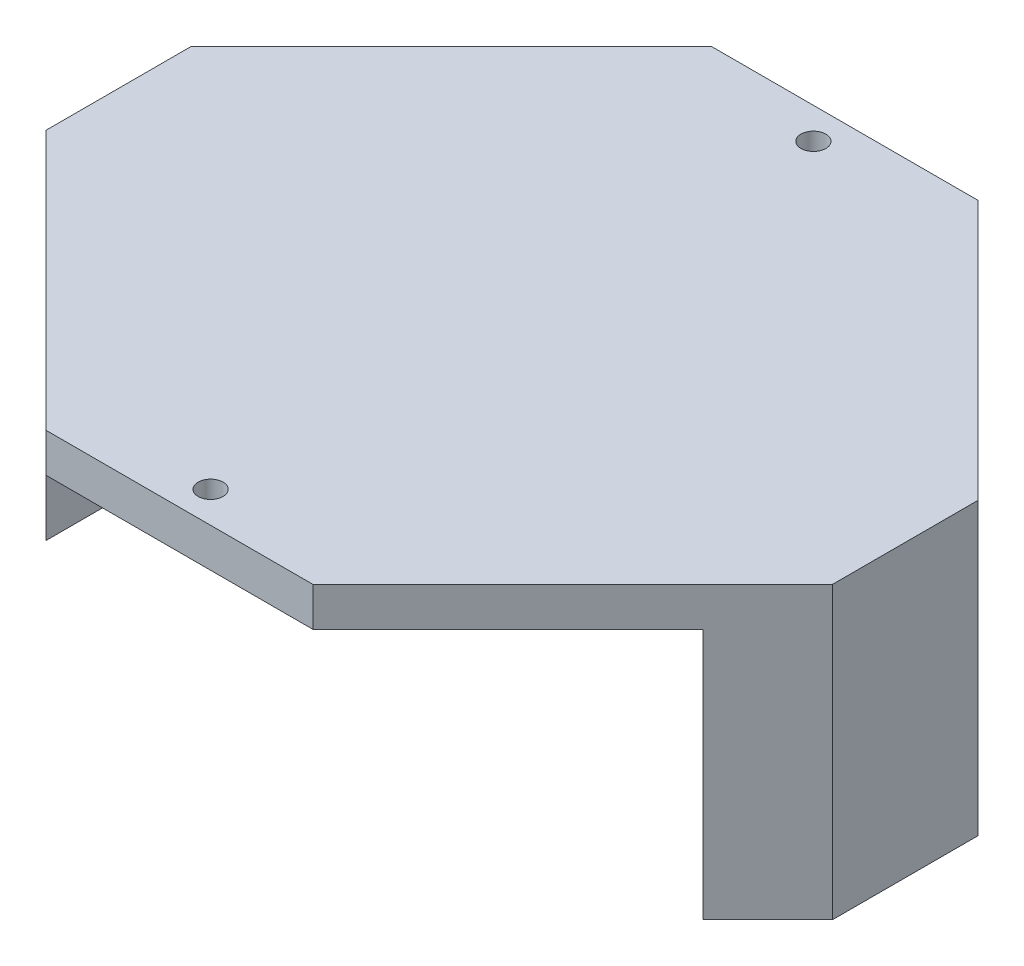
ISO-10303-21;
HEADER;
FILE_DESCRIPTION(('STEP AP214'),'2;1');
FILE_NAME('part.step','',(''),(''),'','','');
FILE_SCHEMA(('AUTOMOTIVE_DESIGN { 1 0 10303 214 1 1 1 1 }'));
ENDSEC;
DATA;
#1=APPLICATION_CONTEXT('core data for automotive mechanical design processes');
#2=APPLICATION_PROTOCOL_DEFINITION('international standard','automotive_design',2000,#1);
#3=PRODUCT_CONTEXT('',#1,'mechanical');
#4=PRODUCT('Part','Part','',(#3));
#5=PRODUCT_RELATED_PRODUCT_CATEGORY('part','',(#4));
#6=PRODUCT_DEFINITION_FORMATION('','',#4);
#7=PRODUCT_DEFINITION_CONTEXT('part definition',#1,'design');
#8=PRODUCT_DEFINITION('design','',#6,#7);
#9=PRODUCT_DEFINITION_SHAPE('','',#8);
#10=(LENGTH_UNIT() NAMED_UNIT(*) SI_UNIT(.MILLI.,.METRE.));
#11=(NAMED_UNIT(*) PLANE_ANGLE_UNIT() SI_UNIT($,.RADIAN.));
#12=(NAMED_UNIT(*) SI_UNIT($,.STERADIAN.) SOLID_ANGLE_UNIT());
#13=UNCERTAINTY_MEASURE_WITH_UNIT(LENGTH_MEASURE(1.E-05),#10,'distance_accuracy_value','');
#14=(GEOMETRIC_REPRESENTATION_CONTEXT(3) GLOBAL_UNCERTAINTY_ASSIGNED_CONTEXT((#13)) GLOBAL_UNIT_ASSIGNED_CONTEXT((#10,
#11,#12)) REPRESENTATION_CONTEXT('',''));
#15=CARTESIAN_POINT('',(0.,0.,0.));
#16=DIRECTION('',(0.,0.,1.));
#17=DIRECTION('',(1.,0.,0.));
#18=AXIS2_PLACEMENT_3D('',#15,#16,#17);
#19=CARTESIAN_POINT('',(0.,12.98575,40.64));
#20=DIRECTION('',(0.,1.,0.));
#21=DIRECTION('',(-1.,0.,0.));
#22=AXIS2_PLACEMENT_3D('',#19,#20,#21);
#23=PLANE('',#22);
#24=CARTESIAN_POINT('',(0.,12.98575,36.83));
#25=DIRECTION('',(0.,1.,0.));
#26=DIRECTION('',(-1.,0.,0.));
#27=AXIS2_PLACEMENT_3D('',#24,#25,#26);
#28=CIRCLE('',#27,1.524);
#29=CARTESIAN_POINT('',(-1.524,12.98575,36.83));
#30=VERTEX_POINT('',#29);
#31=EDGE_CURVE('E186',#30,#30,#28,.T.);
#32=ORIENTED_EDGE('',*,*,#31,.T.);
#33=EDGE_LOOP('',(#32));
#34=FACE_BOUND('',#33,.T.);
#35=CARTESIAN_POINT('',(0.,12.98575,-36.83));
#36=DIRECTION('',(0.,1.,0.));
#37=DIRECTION('',(-1.,0.,0.));
#38=AXIS2_PLACEMENT_3D('',#35,#36,#37);
#39=CIRCLE('',#38,1.524);
#40=CARTESIAN_POINT('',(-1.524,12.98575,-36.83));
#41=VERTEX_POINT('',#40);
#42=EDGE_CURVE('E145',#41,#41,#39,.T.);
#43=ORIENTED_EDGE('',*,*,#42,.T.);
#44=EDGE_LOOP('',(#43));
#45=FACE_BOUND('',#44,.T.);
#46=DIRECTION('',(1.,0.,0.));
#47=VECTOR('',#46,1.);
#48=CARTESIAN_POINT('',(0.,12.98575,40.64));
#49=LINE('',#48,#47);
#50=CARTESIAN_POINT('',(-16.3067999999995,12.98575,40.64));
#51=VERTEX_POINT('',#50);
#52=CARTESIAN_POINT('',(16.3067999999998,12.98575,40.64));
#53=VERTEX_POINT('',#52);
#54=EDGE_CURVE('E152',#51,#53,#49,.T.);
#55=ORIENTED_EDGE('',*,*,#54,.F.);
#56=DIRECTION('',(-0.707106781186551,0.,-0.707106781186544));
#57=VECTOR('',#56,1.);
#58=CARTESIAN_POINT('',(-16.3067999999995,12.98575,40.64));
#59=LINE('',#58,#57);
#60=CARTESIAN_POINT('',(-40.132,12.98575,16.8147999999997));
#61=VERTEX_POINT('',#60);
#62=EDGE_CURVE('E201',#51,#61,#59,.T.);
#63=ORIENTED_EDGE('',*,*,#62,.T.);
#64=DIRECTION('',(0.,0.,-1.));
#65=VECTOR('',#64,1.);
#66=CARTESIAN_POINT('',(-40.132,12.98575,40.64));
#67=LINE('',#66,#65);
#68=CARTESIAN_POINT('',(-40.132,12.98575,-16.8147999999996));
#69=VERTEX_POINT('',#68);
#70=EDGE_CURVE('E159',#61,#69,#67,.T.);
#71=ORIENTED_EDGE('',*,*,#70,.T.);
#72=DIRECTION('',(-0.707106781186544,0.,0.707106781186551));
#73=VECTOR('',#72,1.);
#74=CARTESIAN_POINT('',(-48.0568,12.98575,-8.88999999999945));
#75=LINE('',#74,#73);
#76=CARTESIAN_POINT('',(-16.3067999999998,12.98575,-40.64));
#77=VERTEX_POINT('',#76);
#78=EDGE_CURVE('E199',#69,#77,#75,.F.);
#79=ORIENTED_EDGE('',*,*,#78,.T.);
#80=DIRECTION('',(1.,0.,0.));
#81=VECTOR('',#80,1.);
#82=CARTESIAN_POINT('',(0.,12.98575,-40.64));
#83=LINE('',#82,#81);
#84=CARTESIAN_POINT('',(16.3067999999994,12.98575,-40.64));
#85=VERTEX_POINT('',#84);
#86=EDGE_CURVE('E151',#77,#85,#83,.T.);
#87=ORIENTED_EDGE('',*,*,#86,.T.);
#88=DIRECTION('',(0.707106781186551,0.,0.707106781186544));
#89=VECTOR('',#88,1.);
#90=CARTESIAN_POINT('',(16.3067999999994,12.98575,-40.64));
#91=LINE('',#90,#89);
#92=CARTESIAN_POINT('',(40.132,12.98575,-16.8147999999997));
#93=VERTEX_POINT('',#92);
#94=EDGE_CURVE('E197',#85,#93,#91,.T.);
#95=ORIENTED_EDGE('',*,*,#94,.T.);
#96=DIRECTION('',(0.,0.,-1.));
#97=VECTOR('',#96,1.);
#98=CARTESIAN_POINT('',(40.132,12.98575,40.64));
#99=LINE('',#98,#97);
#100=CARTESIAN_POINT('',(40.132,12.98575,16.8147999999995));
#101=VERTEX_POINT('',#100);
#102=EDGE_CURVE('E182',#101,#93,#99,.T.);
#103=ORIENTED_EDGE('',*,*,#102,.F.);
#104=DIRECTION('',(0.707106781186544,0.,-0.707106781186551));
#105=VECTOR('',#104,1.);
#106=CARTESIAN_POINT('',(48.0568,12.98575,8.88999999999945));
#107=LINE('',#106,#105);
#108=EDGE_CURVE('E195',#101,#53,#107,.F.);
#109=ORIENTED_EDGE('',*,*,#108,.T.);
#110=EDGE_LOOP('',(#55,#63,#71,#79,#87,#95,#103,#109));
#111=FACE_BOUND('',#110,.T.);
#112=ADVANCED_FACE('F33',(#34,#45,#111),#23,.F.);
#113=CARTESIAN_POINT('',(40.132,0.,40.64));
#114=DIRECTION('',(1.,0.,0.));
#115=DIRECTION('',(0.,0.,-1.));
#116=AXIS2_PLACEMENT_3D('',#113,#114,#115);
#117=PLANE('',#116);
#118=ORIENTED_EDGE('',*,*,#102,.T.);
#119=DIRECTION('',(0.,-1.,0.));
#120=VECTOR('',#119,1.);
#121=CARTESIAN_POINT('',(40.132,0.,-16.8147999999997));
#122=LINE('',#121,#120);
#123=CARTESIAN_POINT('',(40.132,-17.74825,-16.8147999999997));
#124=VERTEX_POINT('',#123);
#125=EDGE_CURVE('E231',#93,#124,#122,.T.);
#126=ORIENTED_EDGE('',*,*,#125,.T.);
#127=DIRECTION('',(0.,0.,-1.));
#128=VECTOR('',#127,1.);
#129=CARTESIAN_POINT('',(40.132,-17.74825,40.64));
#130=LINE('',#129,#128);
#131=CARTESIAN_POINT('',(40.132,-17.74825,16.8147999999995));
#132=VERTEX_POINT('',#131);
#133=EDGE_CURVE('E180',#132,#124,#130,.T.);
#134=ORIENTED_EDGE('',*,*,#133,.F.);
#135=DIRECTION('',(0.,-1.,0.));
#136=VECTOR('',#135,1.);
#137=CARTESIAN_POINT('',(40.132,0.,16.8147999999995));
#138=LINE('',#137,#136);
#139=EDGE_CURVE('E229',#132,#101,#138,.F.);
#140=ORIENTED_EDGE('',*,*,#139,.T.);
#141=EDGE_LOOP('',(#118,#126,#134,#140));
#142=FACE_BOUND('',#141,.T.);
#143=ADVANCED_FACE('F242',(#142),#117,.F.);
#144=CARTESIAN_POINT('',(0.,-17.74825,40.64));
#145=DIRECTION('',(0.,1.,0.));
#146=DIRECTION('',(0.,0.,1.));
#147=AXIS2_PLACEMENT_3D('',#144,#145,#146);
#148=PLANE('',#147);
#149=CARTESIAN_POINT('',(44.0944,-17.74825,0.));
#150=DIRECTION('',(0.,-1.,0.));
#151=DIRECTION('',(0.,0.,-1.));
#152=AXIS2_PLACEMENT_3D('',#149,#150,#151);
#153=CIRCLE('',#152,1.524);
#154=CARTESIAN_POINT('',(44.0944,-17.74825,-1.524));
#155=VERTEX_POINT('',#154);
#156=EDGE_CURVE('E138',#155,#155,#153,.T.);
#157=ORIENTED_EDGE('',*,*,#156,.F.);
#158=EDGE_LOOP('',(#157));
#159=FACE_BOUND('',#158,.T.);
#160=ORIENTED_EDGE('',*,*,#133,.T.);
#161=DIRECTION('',(0.707106781186551,0.,0.707106781186544));
#162=VECTOR('',#161,1.);
#163=CARTESIAN_POINT('',(16.3067999999994,-17.74825,-40.64));
#164=LINE('',#163,#162);
#165=CARTESIAN_POINT('',(48.0568,-17.74825,-8.88999999999978));
#166=VERTEX_POINT('',#165);
#167=EDGE_CURVE('E48',#124,#166,#164,.T.);
#168=ORIENTED_EDGE('',*,*,#167,.T.);
#169=DIRECTION('',(0.,0.,-1.));
#170=VECTOR('',#169,1.);
#171=CARTESIAN_POINT('',(48.0568,-17.74825,40.64));
#172=LINE('',#171,#170);
#173=CARTESIAN_POINT('',(48.0568,-17.74825,8.88999999999945));
#174=VERTEX_POINT('',#173);
#175=EDGE_CURVE('E178',#174,#166,#172,.T.);
#176=ORIENTED_EDGE('',*,*,#175,.F.);
#177=DIRECTION('',(0.707106781186544,0.,-0.707106781186551));
#178=VECTOR('',#177,1.);
#179=CARTESIAN_POINT('',(48.0568,-17.74825,8.88999999999945));
#180=LINE('',#179,#178);
#181=EDGE_CURVE('E56',#174,#132,#180,.F.);
#182=ORIENTED_EDGE('',*,*,#181,.T.);
#183=EDGE_LOOP('',(#160,#168,#176,#182));
#184=FACE_BOUND('',#183,.T.);
#185=ADVANCED_FACE('F239',(#159,#184),#148,.F.);
#186=CARTESIAN_POINT('',(48.0568,0.,40.64));
#187=DIRECTION('',(1.,0.,0.));
#188=DIRECTION('',(0.,0.,-1.));
#189=AXIS2_PLACEMENT_3D('',#186,#187,#188);
#190=PLANE('',#189);
#191=ORIENTED_EDGE('',*,*,#175,.T.);
#192=DIRECTION('',(0.,1.,0.));
#193=VECTOR('',#192,1.);
#194=CARTESIAN_POINT('',(48.0568,17.74825,-8.88999999999978));
#195=LINE('',#194,#193);
#196=CARTESIAN_POINT('',(48.0568,17.74825,-8.88999999999978));
#197=VERTEX_POINT('',#196);
#198=EDGE_CURVE('E11',#166,#197,#195,.T.);
#199=ORIENTED_EDGE('',*,*,#198,.T.);
#200=DIRECTION('',(0.,0.,-1.));
#201=VECTOR('',#200,1.);
#202=CARTESIAN_POINT('',(48.0568,17.74825,40.64));
#203=LINE('',#202,#201);
#204=CARTESIAN_POINT('',(48.0568,17.74825,8.88999999999945));
#205=VERTEX_POINT('',#204);
#206=EDGE_CURVE('E175',#205,#197,#203,.T.);
#207=ORIENTED_EDGE('',*,*,#206,.F.);
#208=DIRECTION('',(0.,-1.,0.));
#209=VECTOR('',#208,1.);
#210=CARTESIAN_POINT('',(48.0568,0.,8.88999999999945));
#211=LINE('',#210,#209);
#212=EDGE_CURVE('E41',#205,#174,#211,.T.);
#213=ORIENTED_EDGE('',*,*,#212,.T.);
#214=EDGE_LOOP('',(#191,#199,#207,#213));
#215=FACE_BOUND('',#214,.T.);
#216=ADVANCED_FACE('F236',(#215),#190,.T.);
#217=CARTESIAN_POINT('',(0.,17.74825,40.64));
#218=DIRECTION('',(0.,1.,0.));
#219=DIRECTION('',(0.,0.,1.));
#220=AXIS2_PLACEMENT_3D('',#217,#218,#219);
#221=PLANE('',#220);
#222=CARTESIAN_POINT('',(0.,17.74825,36.83));
#223=DIRECTION('',(0.,1.,0.));
#224=DIRECTION('',(0.,0.,1.));
#225=AXIS2_PLACEMENT_3D('',#222,#223,#224);
#226=CIRCLE('',#225,1.524);
#227=CARTESIAN_POINT('',(0.,17.74825,38.354));
#228=VERTEX_POINT('',#227);
#229=EDGE_CURVE('E190',#228,#228,#226,.T.);
#230=ORIENTED_EDGE('',*,*,#229,.F.);
#231=EDGE_LOOP('',(#230));
#232=FACE_BOUND('',#231,.T.);
#233=CARTESIAN_POINT('',(0.,17.74825,-36.83));
#234=DIRECTION('',(0.,1.,0.));
#235=DIRECTION('',(0.,0.,1.));
#236=AXIS2_PLACEMENT_3D('',#233,#234,#235);
#237=CIRCLE('',#236,1.524);
#238=CARTESIAN_POINT('',(0.,17.74825,-35.306));
#239=VERTEX_POINT('',#238);
#240=EDGE_CURVE('E189',#239,#239,#237,.T.);
#241=ORIENTED_EDGE('',*,*,#240,.F.);
#242=EDGE_LOOP('',(#241));
#243=FACE_BOUND('',#242,.T.);
#244=DIRECTION('',(0.,0.,-1.));
#245=VECTOR('',#244,1.);
#246=CARTESIAN_POINT('',(-48.0568,17.74825,40.64));
#247=LINE('',#246,#245);
#248=CARTESIAN_POINT('',(-48.0568,17.74825,8.88999999999978));
#249=VERTEX_POINT('',#248);
#250=CARTESIAN_POINT('',(-48.0568,17.74825,-8.88999999999945));
#251=VERTEX_POINT('',#250);
#252=EDGE_CURVE('E172',#249,#251,#247,.T.);
#253=ORIENTED_EDGE('',*,*,#252,.F.);
#254=DIRECTION('',(0.707106781186551,0.,0.707106781186544));
#255=VECTOR('',#254,1.);
#256=CARTESIAN_POINT('',(-8.15339999999965,17.74825,48.7933999999997));
#257=LINE('',#256,#255);
#258=CARTESIAN_POINT('',(-16.3067999999995,17.74825,40.64));
#259=VERTEX_POINT('',#258);
#260=EDGE_CURVE('E222',#249,#259,#257,.T.);
#261=ORIENTED_EDGE('',*,*,#260,.T.);
#262=DIRECTION('',(1.,0.,0.));
#263=VECTOR('',#262,1.);
#264=CARTESIAN_POINT('',(0.,17.74825,40.64));
#265=LINE('',#264,#263);
#266=CARTESIAN_POINT('',(16.3067999999998,17.74825,40.64));
#267=VERTEX_POINT('',#266);
#268=EDGE_CURVE('E155',#259,#267,#265,.T.);
#269=ORIENTED_EDGE('',*,*,#268,.T.);
#270=DIRECTION('',(-0.707106781186544,0.,0.707106781186551));
#271=VECTOR('',#270,1.);
#272=CARTESIAN_POINT('',(8.15339999999997,17.74825,48.7933999999999));
#273=LINE('',#272,#271);
#274=EDGE_CURVE('E216',#267,#205,#273,.F.);
#275=ORIENTED_EDGE('',*,*,#274,.T.);
#276=ORIENTED_EDGE('',*,*,#206,.T.);
#277=DIRECTION('',(-0.707106781186551,0.,-0.707106781186544));
#278=VECTOR('',#277,1.);
#279=CARTESIAN_POINT('',(48.7933999999996,17.74825,-8.15340000000014));
#280=LINE('',#279,#278);
#281=CARTESIAN_POINT('',(16.3067999999994,17.74825,-40.64));
#282=VERTEX_POINT('',#281);
#283=EDGE_CURVE('E218',#197,#282,#280,.T.);
#284=ORIENTED_EDGE('',*,*,#283,.T.);
#285=DIRECTION('',(1.,0.,0.));
#286=VECTOR('',#285,1.);
#287=CARTESIAN_POINT('',(0.,17.74825,-40.64));
#288=LINE('',#287,#286);
#289=CARTESIAN_POINT('',(-16.3067999999998,17.74825,-40.64));
#290=VERTEX_POINT('',#289);
#291=EDGE_CURVE('E156',#290,#282,#288,.T.);
#292=ORIENTED_EDGE('',*,*,#291,.F.);
#293=DIRECTION('',(0.707106781186544,0.,-0.707106781186551));
#294=VECTOR('',#293,1.);
#295=CARTESIAN_POINT('',(-48.7934,17.74825,-8.15339999999947));
#296=LINE('',#295,#294);
#297=EDGE_CURVE('E220',#290,#251,#296,.F.);
#298=ORIENTED_EDGE('',*,*,#297,.T.);
#299=EDGE_LOOP('',(#253,#261,#269,#275,#276,#284,#292,#298));
#300=FACE_BOUND('',#299,.T.);
#301=ADVANCED_FACE('F280',(#232,#243,#300),#221,.T.);
#302=CARTESIAN_POINT('',(-48.0568,0.,40.64));
#303=DIRECTION('',(1.,0.,0.));
#304=DIRECTION('',(0.,0.,-1.));
#305=AXIS2_PLACEMENT_3D('',#302,#303,#304);
#306=PLANE('',#305);
#307=DIRECTION('',(0.,0.,-1.));
#308=VECTOR('',#307,1.);
#309=CARTESIAN_POINT('',(-48.0568,-17.74825,40.64));
#310=LINE('',#309,#308);
#311=CARTESIAN_POINT('',(-48.0568,-17.74825,8.88999999999978));
#312=VERTEX_POINT('',#311);
#313=CARTESIAN_POINT('',(-48.0568,-17.74825,-8.88999999999945));
#314=VERTEX_POINT('',#313);
#315=EDGE_CURVE('E169',#312,#314,#310,.T.);
#316=ORIENTED_EDGE('',*,*,#315,.F.);
#317=DIRECTION('',(0.,1.,0.));
#318=VECTOR('',#317,1.);
#319=CARTESIAN_POINT('',(-48.0568,17.74825,8.88999999999978));
#320=LINE('',#319,#318);
#321=EDGE_CURVE('E214',#312,#249,#320,.T.);
#322=ORIENTED_EDGE('',*,*,#321,.T.);
#323=ORIENTED_EDGE('',*,*,#252,.T.);
#324=DIRECTION('',(0.,-1.,0.));
#325=VECTOR('',#324,1.);
#326=CARTESIAN_POINT('',(-48.0568,0.,-8.88999999999945));
#327=LINE('',#326,#325);
#328=EDGE_CURVE('E211',#251,#314,#327,.T.);
#329=ORIENTED_EDGE('',*,*,#328,.T.);
#330=EDGE_LOOP('',(#316,#322,#323,#329));
#331=FACE_BOUND('',#330,.T.);
#332=ADVANCED_FACE('F283',(#331),#306,.F.);
#333=CARTESIAN_POINT('',(-44.0944,-17.74825,0.));
#334=DIRECTION('',(0.,-1.,0.));
#335=DIRECTION('',(0.,0.,-1.));
#336=AXIS2_PLACEMENT_3D('',#333,#334,#335);
#337=CIRCLE('',#336,1.524);
#338=CARTESIAN_POINT('',(-44.0944,-17.74825,-1.524));
#339=VERTEX_POINT('',#338);
#340=EDGE_CURVE('E139',#339,#339,#337,.T.);
#341=ORIENTED_EDGE('',*,*,#340,.F.);
#342=EDGE_LOOP('',(#341));
#343=FACE_BOUND('',#342,.T.);
#344=DIRECTION('',(0.,0.,-1.));
#345=VECTOR('',#344,1.);
#346=CARTESIAN_POINT('',(-40.132,-17.74825,40.64));
#347=LINE('',#346,#345);
#348=CARTESIAN_POINT('',(-40.132,-17.74825,16.8147999999997));
#349=VERTEX_POINT('',#348);
#350=CARTESIAN_POINT('',(-40.132,-17.74825,-16.8147999999996));
#351=VERTEX_POINT('',#350);
#352=EDGE_CURVE('E166',#349,#351,#347,.T.);
#353=ORIENTED_EDGE('',*,*,#352,.F.);
#354=DIRECTION('',(-0.707106781186551,0.,-0.707106781186544));
#355=VECTOR('',#354,1.);
#356=CARTESIAN_POINT('',(-16.3067999999995,-17.74825,40.64));
#357=LINE('',#356,#355);
#358=EDGE_CURVE('E209',#349,#312,#357,.T.);
#359=ORIENTED_EDGE('',*,*,#358,.T.);
#360=ORIENTED_EDGE('',*,*,#315,.T.);
#361=DIRECTION('',(-0.707106781186544,0.,0.707106781186551));
#362=VECTOR('',#361,1.);
#363=CARTESIAN_POINT('',(-48.0568,-17.74825,-8.88999999999945));
#364=LINE('',#363,#362);
#365=EDGE_CURVE('E207',#314,#351,#364,.F.);
#366=ORIENTED_EDGE('',*,*,#365,.T.);
#367=EDGE_LOOP('',(#353,#359,#360,#366));
#368=FACE_BOUND('',#367,.T.);
#369=ADVANCED_FACE('F285',(#343,#368),#148,.F.);
#370=CARTESIAN_POINT('',(-40.132,0.,40.64));
#371=DIRECTION('',(1.,0.,0.));
#372=DIRECTION('',(0.,0.,-1.));
#373=AXIS2_PLACEMENT_3D('',#370,#371,#372);
#374=PLANE('',#373);
#375=ORIENTED_EDGE('',*,*,#70,.F.);
#376=DIRECTION('',(0.,-1.,0.));
#377=VECTOR('',#376,1.);
#378=CARTESIAN_POINT('',(-40.132,0.,16.8147999999997));
#379=LINE('',#378,#377);
#380=EDGE_CURVE('E205',#61,#349,#379,.T.);
#381=ORIENTED_EDGE('',*,*,#380,.T.);
#382=ORIENTED_EDGE('',*,*,#352,.T.);
#383=DIRECTION('',(0.,-1.,0.));
#384=VECTOR('',#383,1.);
#385=CARTESIAN_POINT('',(-40.132,0.,-16.8147999999996));
#386=LINE('',#385,#384);
#387=EDGE_CURVE('E203',#351,#69,#386,.F.);
#388=ORIENTED_EDGE('',*,*,#387,.T.);
#389=EDGE_LOOP('',(#375,#381,#382,#388));
#390=FACE_BOUND('',#389,.T.);
#391=ADVANCED_FACE('F262',(#390),#374,.T.);
#392=CARTESIAN_POINT('',(0.,0.,40.64));
#393=DIRECTION('',(0.,0.,1.));
#394=DIRECTION('',(1.,0.,0.));
#395=AXIS2_PLACEMENT_3D('',#392,#393,#394);
#396=PLANE('',#395);
#397=ORIENTED_EDGE('',*,*,#268,.F.);
#398=DIRECTION('',(0.,-1.,0.));
#399=VECTOR('',#398,1.);
#400=CARTESIAN_POINT('',(-16.3067999999995,-17.74825,40.64));
#401=LINE('',#400,#399);
#402=EDGE_CURVE('E192',#259,#51,#401,.T.);
#403=ORIENTED_EDGE('',*,*,#402,.T.);
#404=ORIENTED_EDGE('',*,*,#54,.T.);
#405=DIRECTION('',(0.,1.,0.));
#406=VECTOR('',#405,1.);
#407=CARTESIAN_POINT('',(16.3067999999998,0.,40.64));
#408=LINE('',#407,#406);
#409=EDGE_CURVE('E185',#53,#267,#408,.T.);
#410=ORIENTED_EDGE('',*,*,#409,.T.);
#411=EDGE_LOOP('',(#397,#403,#404,#410));
#412=FACE_BOUND('',#411,.T.);
#413=ADVANCED_FACE('F251',(#412),#396,.T.);
#414=CARTESIAN_POINT('',(0.,0.,-40.64));
#415=DIRECTION('',(0.,0.,1.));
#416=DIRECTION('',(1.,0.,0.));
#417=AXIS2_PLACEMENT_3D('',#414,#415,#416);
#418=PLANE('',#417);
#419=ORIENTED_EDGE('',*,*,#86,.F.);
#420=DIRECTION('',(0.,1.,0.));
#421=VECTOR('',#420,1.);
#422=CARTESIAN_POINT('',(-16.3067999999998,0.,-40.64));
#423=LINE('',#422,#421);
#424=EDGE_CURVE('E227',#77,#290,#423,.T.);
#425=ORIENTED_EDGE('',*,*,#424,.T.);
#426=ORIENTED_EDGE('',*,*,#291,.T.);
#427=DIRECTION('',(0.,-1.,0.));
#428=VECTOR('',#427,1.);
#429=CARTESIAN_POINT('',(16.3067999999994,-17.74825,-40.64));
#430=LINE('',#429,#428);
#431=EDGE_CURVE('E224',#282,#85,#430,.T.);
#432=ORIENTED_EDGE('',*,*,#431,.T.);
#433=EDGE_LOOP('',(#419,#425,#426,#432));
#434=FACE_BOUND('',#433,.T.);
#435=ADVANCED_FACE('F272',(#434),#418,.F.);
#436=CARTESIAN_POINT('',(44.0944,-5.04825,0.));
#437=DIRECTION('',(0.,-1.,0.));
#438=DIRECTION('',(0.,0.,-1.));
#439=AXIS2_PLACEMENT_3D('',#436,#437,#438);
#440=CONICAL_SURFACE('',#439,1.524,1.02974425867665);
#441=CARTESIAN_POINT('',(44.0944,-4.132538416602,0.));
#442=VERTEX_POINT('',#441);
#443=VERTEX_LOOP('',#442);
#444=FACE_BOUND('',#443,.T.);
#445=CARTESIAN_POINT('',(44.0944,-5.04825,0.));
#446=DIRECTION('',(0.,-1.,0.));
#447=DIRECTION('',(0.,0.,-1.));
#448=AXIS2_PLACEMENT_3D('',#445,#446,#447);
#449=CIRCLE('',#448,1.524);
#450=CARTESIAN_POINT('',(44.0944,-5.04825,-1.524));
#451=VERTEX_POINT('',#450);
#452=EDGE_CURVE('E142',#451,#451,#449,.T.);
#453=ORIENTED_EDGE('',*,*,#452,.T.);
#454=EDGE_LOOP('',(#453));
#455=FACE_BOUND('',#454,.T.);
#456=ADVANCED_FACE('F345',(#444,#455),#440,.F.);
#457=CARTESIAN_POINT('',(44.0944,-17.74825,0.));
#458=DIRECTION('',(0.,-1.,0.));
#459=DIRECTION('',(0.,0.,-1.));
#460=AXIS2_PLACEMENT_3D('',#457,#458,#459);
#461=CYLINDRICAL_SURFACE('',#460,1.524);
#462=ORIENTED_EDGE('',*,*,#452,.F.);
#463=EDGE_LOOP('',(#462));
#464=FACE_BOUND('',#463,.T.);
#465=ORIENTED_EDGE('',*,*,#156,.T.);
#466=EDGE_LOOP('',(#465));
#467=FACE_BOUND('',#466,.T.);
#468=ADVANCED_FACE('F132',(#464,#467),#461,.F.);
#469=CARTESIAN_POINT('',(-44.0944,-5.04825,0.));
#470=DIRECTION('',(0.,-1.,0.));
#471=DIRECTION('',(0.,0.,-1.));
#472=AXIS2_PLACEMENT_3D('',#469,#470,#471);
#473=CONICAL_SURFACE('',#472,1.524,1.02974425867665);
#474=CARTESIAN_POINT('',(-44.0944,-4.132538416602,0.));
#475=VERTEX_POINT('',#474);
#476=VERTEX_LOOP('',#475);
#477=FACE_BOUND('',#476,.T.);
#478=CARTESIAN_POINT('',(-44.0944,-5.04825,0.));
#479=DIRECTION('',(0.,-1.,0.));
#480=DIRECTION('',(0.,0.,-1.));
#481=AXIS2_PLACEMENT_3D('',#478,#479,#480);
#482=CIRCLE('',#481,1.524);
#483=CARTESIAN_POINT('',(-44.0944,-5.04825,-1.524));
#484=VERTEX_POINT('',#483);
#485=EDGE_CURVE('E136',#484,#484,#482,.T.);
#486=ORIENTED_EDGE('',*,*,#485,.T.);
#487=EDGE_LOOP('',(#486));
#488=FACE_BOUND('',#487,.T.);
#489=ADVANCED_FACE('F128',(#477,#488),#473,.F.);
#490=CARTESIAN_POINT('',(-44.0944,-17.74825,0.));
#491=DIRECTION('',(0.,-1.,0.));
#492=DIRECTION('',(0.,0.,-1.));
#493=AXIS2_PLACEMENT_3D('',#490,#491,#492);
#494=CYLINDRICAL_SURFACE('',#493,1.524);
#495=ORIENTED_EDGE('',*,*,#485,.F.);
#496=EDGE_LOOP('',(#495));
#497=FACE_BOUND('',#496,.T.);
#498=ORIENTED_EDGE('',*,*,#340,.T.);
#499=EDGE_LOOP('',(#498));
#500=FACE_BOUND('',#499,.T.);
#501=ADVANCED_FACE('F131',(#497,#500),#494,.F.);
#502=CARTESIAN_POINT('',(0.,17.74825,-36.83));
#503=DIRECTION('',(0.,1.,0.));
#504=DIRECTION('',(0.,0.,1.));
#505=AXIS2_PLACEMENT_3D('',#502,#503,#504);
#506=CYLINDRICAL_SURFACE('',#505,1.524);
#507=ORIENTED_EDGE('',*,*,#240,.T.);
#508=EDGE_LOOP('',(#507));
#509=FACE_BOUND('',#508,.T.);
#510=ORIENTED_EDGE('',*,*,#42,.F.);
#511=EDGE_LOOP('',(#510));
#512=FACE_BOUND('',#511,.T.);
#513=ADVANCED_FACE('F410',(#509,#512),#506,.F.);
#514=CARTESIAN_POINT('',(0.,17.74825,36.83));
#515=DIRECTION('',(0.,1.,0.));
#516=DIRECTION('',(0.,0.,1.));
#517=AXIS2_PLACEMENT_3D('',#514,#515,#516);
#518=CYLINDRICAL_SURFACE('',#517,1.524);
#519=ORIENTED_EDGE('',*,*,#229,.T.);
#520=EDGE_LOOP('',(#519));
#521=FACE_BOUND('',#520,.T.);
#522=ORIENTED_EDGE('',*,*,#31,.F.);
#523=EDGE_LOOP('',(#522));
#524=FACE_BOUND('',#523,.T.);
#525=ADVANCED_FACE('F310',(#521,#524),#518,.F.);
#526=CARTESIAN_POINT('',(-16.3067999999995,0.,40.64));
#527=DIRECTION('',(-0.707106781186544,0.,0.707106781186551));
#528=DIRECTION('',(0.,1.,0.));
#529=AXIS2_PLACEMENT_3D('',#526,#527,#528);
#530=PLANE('',#529);
#531=ORIENTED_EDGE('',*,*,#260,.F.);
#532=ORIENTED_EDGE('',*,*,#321,.F.);
#533=ORIENTED_EDGE('',*,*,#358,.F.);
#534=ORIENTED_EDGE('',*,*,#380,.F.);
#535=ORIENTED_EDGE('',*,*,#62,.F.);
#536=ORIENTED_EDGE('',*,*,#402,.F.);
#537=EDGE_LOOP('',(#531,#532,#533,#534,#535,#536));
#538=FACE_BOUND('',#537,.T.);
#539=ADVANCED_FACE('F255',(#538),#530,.T.);
#540=CARTESIAN_POINT('',(-48.0568,0.,-8.88999999999945));
#541=DIRECTION('',(0.707106781186551,0.,0.707106781186544));
#542=DIRECTION('',(0.,-1.,0.));
#543=AXIS2_PLACEMENT_3D('',#540,#541,#542);
#544=PLANE('',#543);
#545=ORIENTED_EDGE('',*,*,#297,.F.);
#546=ORIENTED_EDGE('',*,*,#424,.F.);
#547=ORIENTED_EDGE('',*,*,#78,.F.);
#548=ORIENTED_EDGE('',*,*,#387,.F.);
#549=ORIENTED_EDGE('',*,*,#365,.F.);
#550=ORIENTED_EDGE('',*,*,#328,.F.);
#551=EDGE_LOOP('',(#545,#546,#547,#548,#549,#550));
#552=FACE_BOUND('',#551,.T.);
#553=ADVANCED_FACE('F267',(#552),#544,.F.);
#554=CARTESIAN_POINT('',(16.3067999999994,0.,-40.64));
#555=DIRECTION('',(0.707106781186544,0.,-0.707106781186551));
#556=DIRECTION('',(0.,1.,0.));
#557=AXIS2_PLACEMENT_3D('',#554,#555,#556);
#558=PLANE('',#557);
#559=ORIENTED_EDGE('',*,*,#283,.F.);
#560=ORIENTED_EDGE('',*,*,#198,.F.);
#561=ORIENTED_EDGE('',*,*,#167,.F.);
#562=ORIENTED_EDGE('',*,*,#125,.F.);
#563=ORIENTED_EDGE('',*,*,#94,.F.);
#564=ORIENTED_EDGE('',*,*,#431,.F.);
#565=EDGE_LOOP('',(#559,#560,#561,#562,#563,#564));
#566=FACE_BOUND('',#565,.T.);
#567=ADVANCED_FACE('F277',(#566),#558,.T.);
#568=CARTESIAN_POINT('',(48.0568,0.,8.88999999999945));
#569=DIRECTION('',(-0.707106781186551,0.,-0.707106781186544));
#570=DIRECTION('',(0.,-1.,0.));
#571=AXIS2_PLACEMENT_3D('',#568,#569,#570);
#572=PLANE('',#571);
#573=ORIENTED_EDGE('',*,*,#274,.F.);
#574=ORIENTED_EDGE('',*,*,#409,.F.);
#575=ORIENTED_EDGE('',*,*,#108,.F.);
#576=ORIENTED_EDGE('',*,*,#139,.F.);
#577=ORIENTED_EDGE('',*,*,#181,.F.);
#578=ORIENTED_EDGE('',*,*,#212,.F.);
#579=EDGE_LOOP('',(#573,#574,#575,#576,#577,#578));
#580=FACE_BOUND('',#579,.T.);
#581=ADVANCED_FACE('F35',(#580),#572,.F.);
#582=CLOSED_SHELL('',(#112,#143,#185,#216,#301,#332,#369,#391,#413,#435,#456,#468,#489,#501,
#513,#525,#539,#553,#567,#581));
#583=MANIFOLD_SOLID_BREP('B2',#582);
#584=ADVANCED_BREP_SHAPE_REPRESENTATION('',(#18,#583),#14);
#585=SHAPE_DEFINITION_REPRESENTATION(#9,#584);
ENDSEC;
END-ISO-10303-21;
